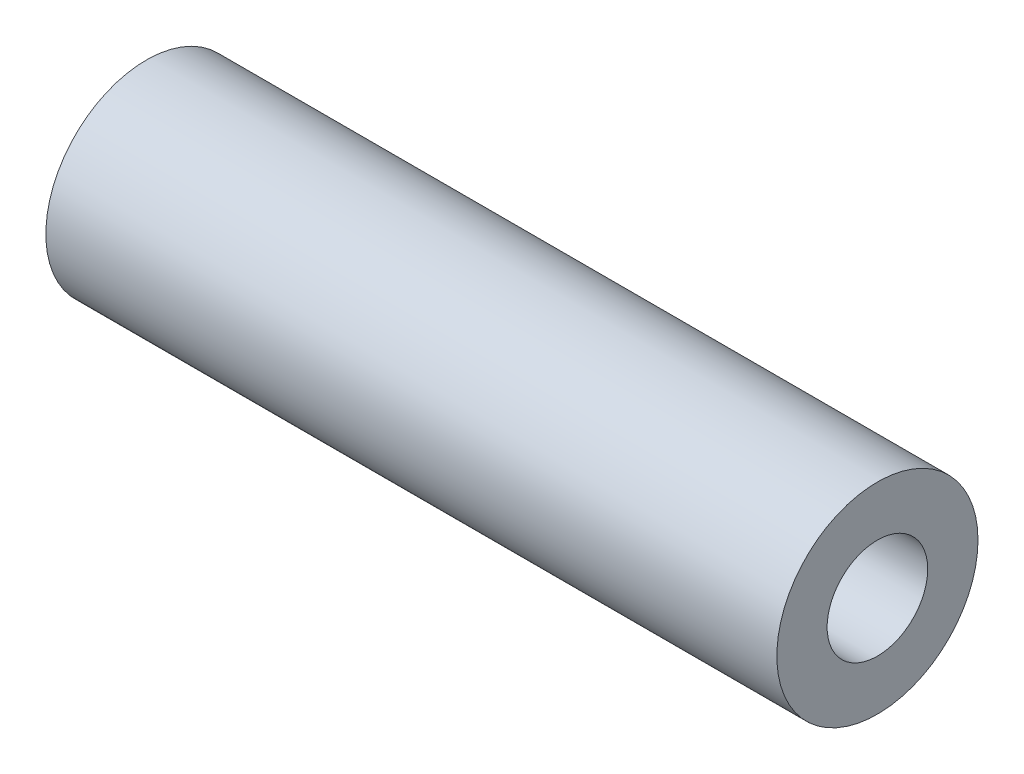
ISO-10303-21;
HEADER;
FILE_DESCRIPTION(('STEP AP214'),'2;1');
FILE_NAME('part.step','',(''),(''),'','','');
FILE_SCHEMA(('AUTOMOTIVE_DESIGN { 1 0 10303 214 1 1 1 1 }'));
ENDSEC;
DATA;
#1=APPLICATION_CONTEXT('core data for automotive mechanical design processes');
#2=APPLICATION_PROTOCOL_DEFINITION('international standard','automotive_design',2000,#1);
#3=PRODUCT_CONTEXT('',#1,'mechanical');
#4=PRODUCT('Part','Part','',(#3));
#5=PRODUCT_RELATED_PRODUCT_CATEGORY('part','',(#4));
#6=PRODUCT_DEFINITION_FORMATION('','',#4);
#7=PRODUCT_DEFINITION_CONTEXT('part definition',#1,'design');
#8=PRODUCT_DEFINITION('design','',#6,#7);
#9=PRODUCT_DEFINITION_SHAPE('','',#8);
#10=(LENGTH_UNIT() NAMED_UNIT(*) SI_UNIT(.MILLI.,.METRE.));
#11=(NAMED_UNIT(*) PLANE_ANGLE_UNIT() SI_UNIT($,.RADIAN.));
#12=(NAMED_UNIT(*) SI_UNIT($,.STERADIAN.) SOLID_ANGLE_UNIT());
#13=UNCERTAINTY_MEASURE_WITH_UNIT(LENGTH_MEASURE(1.E-05),#10,'distance_accuracy_value','');
#14=(GEOMETRIC_REPRESENTATION_CONTEXT(3) GLOBAL_UNCERTAINTY_ASSIGNED_CONTEXT((#13)) GLOBAL_UNIT_ASSIGNED_CONTEXT((#10,
#11,#12)) REPRESENTATION_CONTEXT('',''));
#15=CARTESIAN_POINT('',(0.,0.,0.));
#16=DIRECTION('',(0.,0.,1.));
#17=DIRECTION('',(1.,0.,0.));
#18=AXIS2_PLACEMENT_3D('',#15,#16,#17);
#19=CARTESIAN_POINT('',(23.0759,0.,0.));
#20=DIRECTION('',(1.,0.,0.));
#21=DIRECTION('',(0.,0.,-1.));
#22=AXIS2_PLACEMENT_3D('',#19,#20,#21);
#23=PLANE('',#22);
#24=CARTESIAN_POINT('',(23.0759,0.,0.));
#25=DIRECTION('',(1.,0.,0.));
#26=DIRECTION('',(0.,0.,-1.));
#27=AXIS2_PLACEMENT_3D('',#24,#25,#26);
#28=CIRCLE('',#27,6.35);
#29=CARTESIAN_POINT('',(23.0759,0.,-6.35));
#30=VERTEX_POINT('',#29);
#31=EDGE_CURVE('E10',#30,#30,#28,.T.);
#32=ORIENTED_EDGE('',*,*,#31,.T.);
#33=EDGE_LOOP('',(#32));
#34=FACE_BOUND('',#33,.T.);
#35=CARTESIAN_POINT('',(23.0759,0.,0.));
#36=DIRECTION('',(1.,0.,0.));
#37=DIRECTION('',(0.,0.,-1.));
#38=AXIS2_PLACEMENT_3D('',#35,#36,#37);
#39=CIRCLE('',#38,3.175);
#40=CARTESIAN_POINT('',(23.0759,0.,-3.175));
#41=VERTEX_POINT('',#40);
#42=EDGE_CURVE('E50',#41,#41,#39,.T.);
#43=ORIENTED_EDGE('',*,*,#42,.F.);
#44=EDGE_LOOP('',(#43));
#45=FACE_BOUND('',#44,.T.);
#46=ADVANCED_FACE('F37',(#34,#45),#23,.T.);
#47=CARTESIAN_POINT('',(-23.0759,0.,0.));
#48=DIRECTION('',(1.,0.,0.));
#49=DIRECTION('',(0.,0.,-1.));
#50=AXIS2_PLACEMENT_3D('',#47,#48,#49);
#51=PLANE('',#50);
#52=CARTESIAN_POINT('',(-23.0759,0.,0.));
#53=DIRECTION('',(1.,0.,0.));
#54=DIRECTION('',(0.,0.,-1.));
#55=AXIS2_PLACEMENT_3D('',#52,#53,#54);
#56=CIRCLE('',#55,6.35);
#57=CARTESIAN_POINT('',(-23.0759,0.,-6.35));
#58=VERTEX_POINT('',#57);
#59=EDGE_CURVE('E41',#58,#58,#56,.T.);
#60=ORIENTED_EDGE('',*,*,#59,.F.);
#61=EDGE_LOOP('',(#60));
#62=FACE_BOUND('',#61,.T.);
#63=CARTESIAN_POINT('',(-23.0759,0.,0.));
#64=DIRECTION('',(1.,0.,0.));
#65=DIRECTION('',(0.,0.,-1.));
#66=AXIS2_PLACEMENT_3D('',#63,#64,#65);
#67=CIRCLE('',#66,3.175);
#68=CARTESIAN_POINT('',(-23.0759,0.,-3.175));
#69=VERTEX_POINT('',#68);
#70=EDGE_CURVE('E52',#69,#69,#67,.T.);
#71=ORIENTED_EDGE('',*,*,#70,.T.);
#72=EDGE_LOOP('',(#71));
#73=FACE_BOUND('',#72,.T.);
#74=ADVANCED_FACE('F64',(#62,#73),#51,.F.);
#75=CARTESIAN_POINT('',(23.0759,0.,0.));
#76=DIRECTION('',(-1.,0.,0.));
#77=DIRECTION('',(0.,0.,1.));
#78=AXIS2_PLACEMENT_3D('',#75,#76,#77);
#79=CYLINDRICAL_SURFACE('',#78,6.35);
#80=ORIENTED_EDGE('',*,*,#31,.F.);
#81=EDGE_LOOP('',(#80));
#82=FACE_BOUND('',#81,.T.);
#83=ORIENTED_EDGE('',*,*,#59,.T.);
#84=EDGE_LOOP('',(#83));
#85=FACE_BOUND('',#84,.T.);
#86=ADVANCED_FACE('F39',(#82,#85),#79,.T.);
#87=CARTESIAN_POINT('',(23.0759,0.,0.));
#88=DIRECTION('',(-1.,0.,0.));
#89=DIRECTION('',(0.,0.,1.));
#90=AXIS2_PLACEMENT_3D('',#87,#88,#89);
#91=CYLINDRICAL_SURFACE('',#90,3.175);
#92=ORIENTED_EDGE('',*,*,#42,.T.);
#93=EDGE_LOOP('',(#92));
#94=FACE_BOUND('',#93,.T.);
#95=ORIENTED_EDGE('',*,*,#70,.F.);
#96=EDGE_LOOP('',(#95));
#97=FACE_BOUND('',#96,.T.);
#98=ADVANCED_FACE('F60',(#94,#97),#91,.F.);
#99=CLOSED_SHELL('',(#46,#74,#86,#98));
#100=MANIFOLD_SOLID_BREP('B2',#99);
#101=ADVANCED_BREP_SHAPE_REPRESENTATION('',(#18,#100),#14);
#102=SHAPE_DEFINITION_REPRESENTATION(#9,#101);
ENDSEC;
END-ISO-10303-21;
